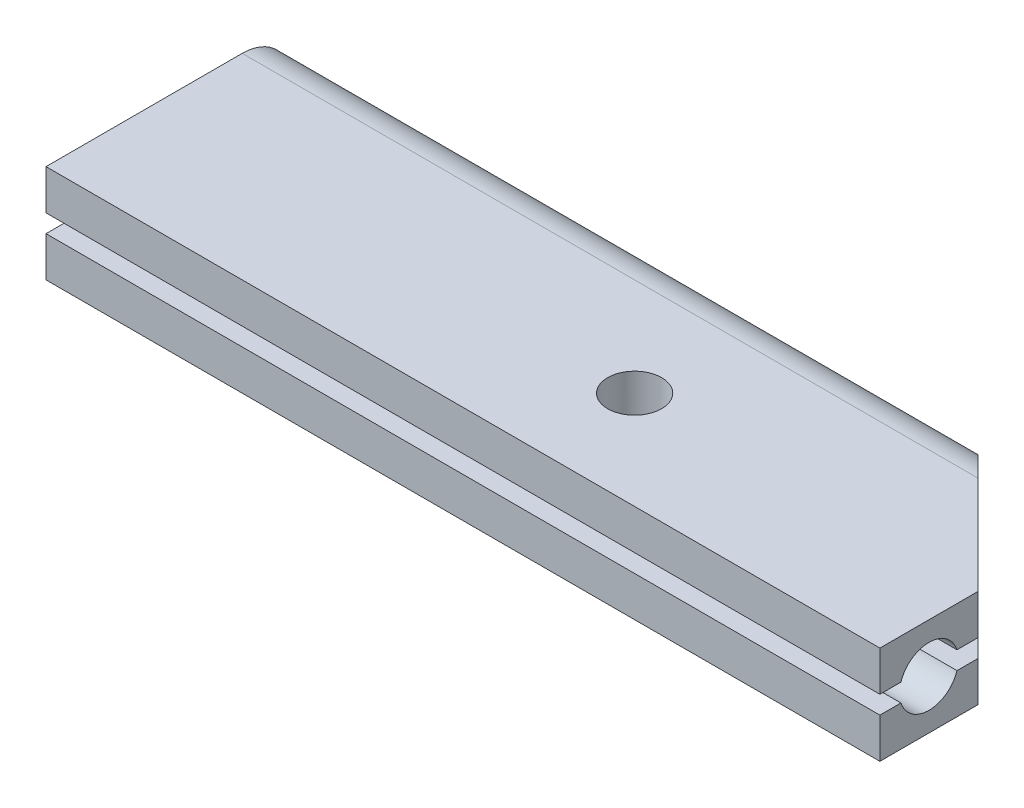
ISO-10303-21;
HEADER;
FILE_DESCRIPTION(('STEP AP214'),'2;1');
FILE_NAME('part.step','',(''),(''),'','','');
FILE_SCHEMA(('AUTOMOTIVE_DESIGN { 1 0 10303 214 1 1 1 1 }'));
ENDSEC;
DATA;
#1=APPLICATION_CONTEXT('core data for automotive mechanical design processes');
#2=APPLICATION_PROTOCOL_DEFINITION('international standard','automotive_design',2000,#1);
#3=PRODUCT_CONTEXT('',#1,'mechanical');
#4=PRODUCT('Part','Part','',(#3));
#5=PRODUCT_RELATED_PRODUCT_CATEGORY('part','',(#4));
#6=PRODUCT_DEFINITION_FORMATION('','',#4);
#7=PRODUCT_DEFINITION_CONTEXT('part definition',#1,'design');
#8=PRODUCT_DEFINITION('design','',#6,#7);
#9=PRODUCT_DEFINITION_SHAPE('','',#8);
#10=(LENGTH_UNIT() NAMED_UNIT(*) SI_UNIT(.MILLI.,.METRE.));
#11=(NAMED_UNIT(*) PLANE_ANGLE_UNIT() SI_UNIT($,.RADIAN.));
#12=(NAMED_UNIT(*) SI_UNIT($,.STERADIAN.) SOLID_ANGLE_UNIT());
#13=UNCERTAINTY_MEASURE_WITH_UNIT(LENGTH_MEASURE(1.E-05),#10,'distance_accuracy_value','');
#14=(GEOMETRIC_REPRESENTATION_CONTEXT(3) GLOBAL_UNCERTAINTY_ASSIGNED_CONTEXT((#13)) GLOBAL_UNIT_ASSIGNED_CONTEXT((#10,
#11,#12)) REPRESENTATION_CONTEXT('',''));
#15=CARTESIAN_POINT('',(0.,0.,0.));
#16=DIRECTION('',(0.,0.,1.));
#17=DIRECTION('',(1.,0.,0.));
#18=AXIS2_PLACEMENT_3D('',#15,#16,#17);
#19=CARTESIAN_POINT('',(0.,2.,0.));
#20=DIRECTION('',(0.,0.,-1.));
#21=DIRECTION('',(-1.,0.,0.));
#22=AXIS2_PLACEMENT_3D('',#19,#20,#21);
#23=PLANE('',#22);
#24=DIRECTION('',(0.,-1.,0.));
#25=VECTOR('',#24,1.);
#26=CARTESIAN_POINT('',(0.,2.,0.));
#27=LINE('',#26,#25);
#28=CARTESIAN_POINT('',(0.,2.,0.));
#29=VERTEX_POINT('',#28);
#30=CARTESIAN_POINT('',(0.,1.18360983346122,0.));
#31=VERTEX_POINT('',#30);
#32=EDGE_CURVE('E253',#29,#31,#27,.T.);
#33=ORIENTED_EDGE('',*,*,#32,.T.);
#34=DIRECTION('',(1.,0.,0.));
#35=VECTOR('',#34,1.);
#36=CARTESIAN_POINT('',(0.,1.18360983346122,0.));
#37=LINE('',#36,#35);
#38=CARTESIAN_POINT('',(17.,1.18360983346122,0.));
#39=VERTEX_POINT('',#38);
#40=EDGE_CURVE('E291',#31,#39,#37,.T.);
#41=ORIENTED_EDGE('',*,*,#40,.T.);
#42=DIRECTION('',(0.,-1.,0.));
#43=VECTOR('',#42,1.);
#44=CARTESIAN_POINT('',(17.,2.,0.));
#45=LINE('',#44,#43);
#46=CARTESIAN_POINT('',(17.,2.,0.));
#47=VERTEX_POINT('',#46);
#48=EDGE_CURVE('E262',#47,#39,#45,.T.);
#49=ORIENTED_EDGE('',*,*,#48,.F.);
#50=DIRECTION('',(1.,0.,0.));
#51=VECTOR('',#50,1.);
#52=CARTESIAN_POINT('',(0.,2.,0.));
#53=LINE('',#52,#51);
#54=EDGE_CURVE('E226',#29,#47,#53,.T.);
#55=ORIENTED_EDGE('',*,*,#54,.F.);
#56=EDGE_LOOP('',(#33,#41,#49,#55));
#57=FACE_BOUND('',#56,.T.);
#58=ADVANCED_FACE('F40',(#57),#23,.F.);
#59=CARTESIAN_POINT('',(17.,2.,0.));
#60=DIRECTION('',(-1.,0.,0.));
#61=DIRECTION('',(0.,0.,1.));
#62=AXIS2_PLACEMENT_3D('',#59,#60,#61);
#63=PLANE('',#62);
#64=ORIENTED_EDGE('',*,*,#48,.T.);
#65=DIRECTION('',(0.,0.,-1.));
#66=VECTOR('',#65,1.);
#67=CARTESIAN_POINT('',(17.,1.18360983346122,4.));
#68=LINE('',#67,#66);
#69=CARTESIAN_POINT('',(17.,1.18360983346122,-0.428784253494056));
#70=VERTEX_POINT('',#69);
#71=EDGE_CURVE('E315',#39,#70,#68,.T.);
#72=ORIENTED_EDGE('',*,*,#71,.T.);
#73=CARTESIAN_POINT('',(17.,1.,-1.));
#74=DIRECTION('',(1.,0.,0.));
#75=DIRECTION('',(0.,0.,-1.));
#76=AXIS2_PLACEMENT_3D('',#73,#74,#75);
#77=CIRCLE('',#76,0.6);
#78=CARTESIAN_POINT('',(17.,1.18360983346122,-1.57121574650594));
#79=VERTEX_POINT('',#78);
#80=EDGE_CURVE('E198',#79,#70,#77,.T.);
#81=ORIENTED_EDGE('',*,*,#80,.F.);
#82=CARTESIAN_POINT('',(17.,1.18360983346122,-2.));
#83=VERTEX_POINT('',#82);
#84=EDGE_CURVE('E327',#79,#83,#68,.T.);
#85=ORIENTED_EDGE('',*,*,#84,.T.);
#86=DIRECTION('',(0.,-1.,0.));
#87=VECTOR('',#86,1.);
#88=CARTESIAN_POINT('',(17.,2.,-2.));
#89=LINE('',#88,#87);
#90=CARTESIAN_POINT('',(17.,2.,-2.));
#91=VERTEX_POINT('',#90);
#92=EDGE_CURVE('E257',#91,#83,#89,.T.);
#93=ORIENTED_EDGE('',*,*,#92,.F.);
#94=DIRECTION('',(0.,0.,-1.));
#95=VECTOR('',#94,1.);
#96=CARTESIAN_POINT('',(17.,2.,0.));
#97=LINE('',#96,#95);
#98=EDGE_CURVE('E230',#47,#91,#97,.T.);
#99=ORIENTED_EDGE('',*,*,#98,.F.);
#100=EDGE_LOOP('',(#64,#72,#81,#85,#93,#99));
#101=FACE_BOUND('',#100,.T.);
#102=ADVANCED_FACE('F378',(#101),#63,.F.);
#103=CARTESIAN_POINT('',(0.,1.,-1.));
#104=DIRECTION('',(1.,0.,0.));
#105=DIRECTION('',(0.,0.,-1.));
#106=AXIS2_PLACEMENT_3D('',#103,#104,#105);
#107=CYLINDRICAL_SURFACE('',#106,0.6);
#108=DIRECTION('',(1.,0.,0.));
#109=VECTOR('',#108,1.);
#110=CARTESIAN_POINT('',(0.,1.18360983346122,-1.57121574650594));
#111=LINE('',#110,#109);
#112=CARTESIAN_POINT('',(0.,1.18360983346122,-1.57121574650594));
#113=VERTEX_POINT('',#112);
#114=CARTESIAN_POINT('',(9.65555252366211,1.18360983346122,-1.57121574650594));
#115=VERTEX_POINT('',#114);
#116=EDGE_CURVE('E186',#113,#115,#111,.T.);
#117=ORIENTED_EDGE('',*,*,#116,.T.);
#118=CARTESIAN_POINT('',(9.65555252366211,1.18360983346122,-1.57121574650594));
#119=CARTESIAN_POINT('',(9.66279970457695,1.2017996989591,-1.56540068980402));
#120=CARTESIAN_POINT('',(9.67137012518386,1.21922681571415,-1.55881056116524));
#121=CARTESIAN_POINT('',(9.69114316293411,1.25211460788407,-1.54474608212787));
#122=CARTESIAN_POINT('',(9.70234543544478,1.26757554035632,-1.53727184756372));
#123=CARTESIAN_POINT('',(9.72740336090944,1.29613326157097,-1.5220828642431));
#124=CARTESIAN_POINT('',(9.74126605075027,1.30922359742965,-1.51436752410566));
#125=CARTESIAN_POINT('',(9.77134840294039,1.33270370346373,-1.49950097839327));
#126=CARTESIAN_POINT('',(9.78756549894581,1.34309638018076,-1.49234917148703));
#127=CARTESIAN_POINT('',(9.8213114480067,1.36078019945433,-1.47953449579756));
#128=CARTESIAN_POINT('',(9.83877251604817,1.36816909503888,-1.47382747341874));
#129=CARTESIAN_POINT('',(9.87500860454101,1.38040509689461,-1.46406200810876));
#130=CARTESIAN_POINT('',(9.89378448637781,1.38525051884221,-1.46000465801333));
#131=CARTESIAN_POINT('',(9.9323261560955,1.39251065343406,-1.45382659913236));
#132=CARTESIAN_POINT('',(9.95210054913085,1.39489809442002,-1.45172764247009));
#133=CARTESIAN_POINT('',(9.99190095940925,1.3972070888115,-1.44969865997932));
#134=CARTESIAN_POINT('',(10.0119269709472,1.39712869802611,-1.44976858506259));
#135=CARTESIAN_POINT('',(10.0521374086804,1.3944746134966,-1.45209847924781));
#136=CARTESIAN_POINT('',(10.0723153900627,1.39184320536989,-1.45440730725256));
#137=CARTESIAN_POINT('',(10.111788693259,1.38393419343475,-1.46110862807258));
#138=CARTESIAN_POINT('',(10.1310840762296,1.37865677327609,-1.46550097627738));
#139=CARTESIAN_POINT('',(10.1680651410834,1.36542360170452,-1.47595768293658));
#140=CARTESIAN_POINT('',(10.1857625801894,1.35748985824932,-1.48200823059855));
#141=CARTESIAN_POINT('',(10.219196436814,1.33891052240597,-1.49524634912894));
#142=CARTESIAN_POINT('',(10.2349334605517,1.32826577145779,-1.50243356693687));
#143=CARTESIAN_POINT('',(10.2636900709056,1.30467507731902,-1.51706926329337));
#144=CARTESIAN_POINT('',(10.276766729627,1.29179181737611,-1.52450704539664));
#145=CARTESIAN_POINT('',(10.3004716631775,1.26381527756615,-1.53911918438621));
#146=CARTESIAN_POINT('',(10.3111006983645,1.24872268642057,-1.54629362249693));
#147=CARTESIAN_POINT('',(10.3250655911445,1.2249348205964,-1.55630614870017));
#148=CARTESIAN_POINT('',(10.3293495519523,1.21691970932856,-1.55948399217574));
#149=CARTESIAN_POINT('',(10.3373305592435,1.2005280864668,-1.56556593460097));
#150=CARTESIAN_POINT('',(10.3410289440165,1.19215245625575,-1.56847065139938));
#151=CARTESIAN_POINT('',(10.3444474763379,1.18360983346122,-1.57121574650594));
#152=B_SPLINE_CURVE_WITH_KNOTS('',3,(#118,#119,#120,#121,#122,#123,#124,#125,#126,#127,#128,
#129,#130,#131,#132,#133,#134,#135,#136,#137,#138,#139,#140,#141,#142,#143,#144,#145,#146,#147,
#148,#149,#150,#151),.UNSPECIFIED.,.F.,.F.,(4,2,2,2,2,2,2,2,2,2,2,2,2,2,2,2,4),(0.,
0.0612291886485581,0.122450363993332,0.183835760494648,0.24515474133408,0.30427752001567,
0.363439401387274,0.423250840670739,0.483060926244769,0.544206299906491,0.605347430284473,
0.665994042612836,0.726621854394047,0.785766120808207,0.844891989110295,0.873750915169892,
0.902542903466302),.UNSPECIFIED.);
#153=CARTESIAN_POINT('',(10.3444474763379,1.18360983346122,-1.57121574650594));
#154=VERTEX_POINT('',#153);
#155=EDGE_CURVE('E55',#115,#154,#152,.T.);
#156=ORIENTED_EDGE('',*,*,#155,.T.);
#157=EDGE_CURVE('E180',#154,#79,#111,.T.);
#158=ORIENTED_EDGE('',*,*,#157,.T.);
#159=ORIENTED_EDGE('',*,*,#80,.T.);
#160=DIRECTION('',(1.,0.,0.));
#161=VECTOR('',#160,1.);
#162=CARTESIAN_POINT('',(0.,1.18360983346122,-0.428784253494056));
#163=LINE('',#162,#161);
#164=CARTESIAN_POINT('',(0.,1.18360983346122,-0.428784253494056));
#165=VERTEX_POINT('',#164);
#166=EDGE_CURVE('E49',#70,#165,#163,.F.);
#167=ORIENTED_EDGE('',*,*,#166,.T.);
#168=CARTESIAN_POINT('',(0.,1.,-1.));
#169=DIRECTION('',(1.,0.,0.));
#170=DIRECTION('',(0.,0.,-1.));
#171=AXIS2_PLACEMENT_3D('',#168,#169,#170);
#172=CIRCLE('',#171,0.6);
#173=EDGE_CURVE('E196',#113,#165,#172,.T.);
#174=ORIENTED_EDGE('',*,*,#173,.F.);
#175=EDGE_LOOP('',(#117,#156,#158,#159,#167,#174));
#176=FACE_BOUND('',#175,.T.);
#177=ADVANCED_FACE('F195',(#176),#107,.F.);
#178=CARTESIAN_POINT('',(17.,0.816390166538781,0.));
#179=VERTEX_POINT('',#178);
#180=CARTESIAN_POINT('',(17.,0.,0.));
#181=VERTEX_POINT('',#180);
#182=EDGE_CURVE('E261',#179,#181,#45,.T.);
#183=ORIENTED_EDGE('',*,*,#182,.F.);
#184=DIRECTION('',(-1.,0.,0.));
#185=VECTOR('',#184,1.);
#186=CARTESIAN_POINT('',(0.,0.816390166538781,0.));
#187=LINE('',#186,#185);
#188=CARTESIAN_POINT('',(0.,0.816390166538781,0.));
#189=VERTEX_POINT('',#188);
#190=EDGE_CURVE('E302',#179,#189,#187,.T.);
#191=ORIENTED_EDGE('',*,*,#190,.T.);
#192=CARTESIAN_POINT('',(0.,0.,0.));
#193=VERTEX_POINT('',#192);
#194=EDGE_CURVE('E241',#189,#193,#27,.T.);
#195=ORIENTED_EDGE('',*,*,#194,.T.);
#196=DIRECTION('',(1.,0.,0.));
#197=VECTOR('',#196,1.);
#198=CARTESIAN_POINT('',(0.,0.,0.));
#199=LINE('',#198,#197);
#200=EDGE_CURVE('E211',#193,#181,#199,.T.);
#201=ORIENTED_EDGE('',*,*,#200,.T.);
#202=EDGE_LOOP('',(#183,#191,#195,#201));
#203=FACE_BOUND('',#202,.T.);
#204=ADVANCED_FACE('F380',(#203),#23,.F.);
#205=CARTESIAN_POINT('',(17.,0.816390166538781,-2.));
#206=VERTEX_POINT('',#205);
#207=CARTESIAN_POINT('',(17.,0.,-2.));
#208=VERTEX_POINT('',#207);
#209=EDGE_CURVE('E256',#206,#208,#89,.T.);
#210=ORIENTED_EDGE('',*,*,#209,.F.);
#211=DIRECTION('',(0.,0.,1.));
#212=VECTOR('',#211,1.);
#213=CARTESIAN_POINT('',(17.,0.816390166538782,4.));
#214=LINE('',#213,#212);
#215=CARTESIAN_POINT('',(17.,0.816390166538781,-1.57121574650594));
#216=VERTEX_POINT('',#215);
#217=EDGE_CURVE('E331',#206,#216,#214,.T.);
#218=ORIENTED_EDGE('',*,*,#217,.T.);
#219=CARTESIAN_POINT('',(17.,0.816390166538781,-0.428784253494056));
#220=VERTEX_POINT('',#219);
#221=EDGE_CURVE('E225',#220,#216,#77,.T.);
#222=ORIENTED_EDGE('',*,*,#221,.F.);
#223=EDGE_CURVE('E332',#220,#179,#214,.T.);
#224=ORIENTED_EDGE('',*,*,#223,.T.);
#225=ORIENTED_EDGE('',*,*,#182,.T.);
#226=DIRECTION('',(0.,0.,-1.));
#227=VECTOR('',#226,1.);
#228=CARTESIAN_POINT('',(17.,0.,0.));
#229=LINE('',#228,#227);
#230=EDGE_CURVE('E217',#181,#208,#229,.T.);
#231=ORIENTED_EDGE('',*,*,#230,.T.);
#232=EDGE_LOOP('',(#210,#218,#222,#224,#225,#231));
#233=FACE_BOUND('',#232,.T.);
#234=ADVANCED_FACE('F386',(#233),#63,.F.);
#235=CARTESIAN_POINT('',(9.5000000000001,2.,-9.49999999999999));
#236=DIRECTION('',(0.707106781186552,0.,-0.707106781186544));
#237=DIRECTION('',(-0.707106781186544,0.,-0.707106781186551));
#238=AXIS2_PLACEMENT_3D('',#235,#236,#237);
#239=PLANE('',#238);
#240=DIRECTION('',(0.707106781186544,0.,0.707106781186551));
#241=VECTOR('',#240,1.);
#242=CARTESIAN_POINT('',(9.5000000000001,1.18360983346122,-9.49999999999999));
#243=LINE('',#242,#241);
#244=CARTESIAN_POINT('',(15.,1.18360983346122,-4.));
#245=VERTEX_POINT('',#244);
#246=EDGE_CURVE('E298',#245,#83,#243,.T.);
#247=ORIENTED_EDGE('',*,*,#246,.F.);
#248=DIRECTION('',(0.,1.,0.));
#249=VECTOR('',#248,1.);
#250=CARTESIAN_POINT('',(15.,2.,-4.));
#251=LINE('',#250,#249);
#252=CARTESIAN_POINT('',(15.,0.816390166538781,-4.));
#253=VERTEX_POINT('',#252);
#254=EDGE_CURVE('E221',#253,#245,#251,.T.);
#255=ORIENTED_EDGE('',*,*,#254,.F.);
#256=DIRECTION('',(-0.707106781186544,0.,-0.707106781186551));
#257=VECTOR('',#256,1.);
#258=CARTESIAN_POINT('',(9.5000000000001,0.81639016653878,-9.49999999999999));
#259=LINE('',#258,#257);
#260=EDGE_CURVE('E308',#206,#253,#259,.T.);
#261=ORIENTED_EDGE('',*,*,#260,.F.);
#262=ORIENTED_EDGE('',*,*,#209,.T.);
#263=DIRECTION('',(0.707106781186544,0.,0.707106781186551));
#264=VECTOR('',#263,1.);
#265=CARTESIAN_POINT('',(9.5000000000001,0.,-9.49999999999999));
#266=LINE('',#265,#264);
#267=CARTESIAN_POINT('',(15.,0.,-4.));
#268=VERTEX_POINT('',#267);
#269=EDGE_CURVE('E246',#268,#208,#266,.T.);
#270=ORIENTED_EDGE('',*,*,#269,.F.);
#271=CARTESIAN_POINT('',(15.,1.,-4.));
#272=DIRECTION('',(0.707106781186552,0.,-0.707106781186544));
#273=DIRECTION('',(-0.707106781186544,0.,-0.707106781186551));
#274=AXIS2_PLACEMENT_3D('',#271,#272,#273);
#275=ELLIPSE('',#274,1.41421356237309,1.);
#276=CARTESIAN_POINT('',(14.,1.,-5.));
#277=VERTEX_POINT('',#276);
#278=EDGE_CURVE('E273',#268,#277,#275,.T.);
#279=ORIENTED_EDGE('',*,*,#278,.T.);
#280=CARTESIAN_POINT('',(15.,1.,-4.));
#281=DIRECTION('',(0.707106781186552,0.,-0.707106781186544));
#282=DIRECTION('',(0.707106781186544,0.,0.707106781186551));
#283=AXIS2_PLACEMENT_3D('',#280,#281,#282);
#284=ELLIPSE('',#283,1.41421356237309,1.);
#285=CARTESIAN_POINT('',(15.,2.,-4.));
#286=VERTEX_POINT('',#285);
#287=EDGE_CURVE('E270',#277,#286,#284,.T.);
#288=ORIENTED_EDGE('',*,*,#287,.T.);
#289=DIRECTION('',(0.707106781186544,0.,0.707106781186551));
#290=VECTOR('',#289,1.);
#291=CARTESIAN_POINT('',(9.5000000000001,2.,-9.49999999999999));
#292=LINE('',#291,#290);
#293=EDGE_CURVE('E235',#286,#91,#292,.T.);
#294=ORIENTED_EDGE('',*,*,#293,.T.);
#295=ORIENTED_EDGE('',*,*,#92,.T.);
#296=EDGE_LOOP('',(#247,#255,#261,#262,#270,#279,#288,#294,#295));
#297=FACE_BOUND('',#296,.T.);
#298=ADVANCED_FACE('F393',(#297),#239,.T.);
#299=CARTESIAN_POINT('',(0.,2.,0.));
#300=DIRECTION('',(-1.,0.,0.));
#301=DIRECTION('',(0.,0.,1.));
#302=AXIS2_PLACEMENT_3D('',#299,#300,#301);
#303=PLANE('',#302);
#304=DIRECTION('',(0.,0.,-1.));
#305=VECTOR('',#304,1.);
#306=CARTESIAN_POINT('',(0.,1.18360983346122,4.));
#307=LINE('',#306,#305);
#308=EDGE_CURVE('E205',#31,#165,#307,.T.);
#309=ORIENTED_EDGE('',*,*,#308,.F.);
#310=ORIENTED_EDGE('',*,*,#32,.F.);
#311=DIRECTION('',(0.,0.,-1.));
#312=VECTOR('',#311,1.);
#313=CARTESIAN_POINT('',(0.,2.,0.));
#314=LINE('',#313,#312);
#315=CARTESIAN_POINT('',(0.,2.,-4.));
#316=VERTEX_POINT('',#315);
#317=EDGE_CURVE('E238',#29,#316,#314,.T.);
#318=ORIENTED_EDGE('',*,*,#317,.T.);
#319=CARTESIAN_POINT('',(0.,1.,-4.));
#320=DIRECTION('',(-1.,0.,0.));
#321=DIRECTION('',(0.,0.,1.));
#322=AXIS2_PLACEMENT_3D('',#319,#320,#321);
#323=CIRCLE('',#322,1.);
#324=CARTESIAN_POINT('',(0.,1.,-5.));
#325=VERTEX_POINT('',#324);
#326=EDGE_CURVE('E276',#316,#325,#323,.T.);
#327=ORIENTED_EDGE('',*,*,#326,.T.);
#328=CARTESIAN_POINT('',(0.,1.,-4.));
#329=DIRECTION('',(-1.,0.,0.));
#330=DIRECTION('',(0.,0.,1.));
#331=AXIS2_PLACEMENT_3D('',#328,#329,#330);
#332=CIRCLE('',#331,1.);
#333=CARTESIAN_POINT('',(0.,0.,-4.));
#334=VERTEX_POINT('',#333);
#335=EDGE_CURVE('E279',#325,#334,#332,.T.);
#336=ORIENTED_EDGE('',*,*,#335,.T.);
#337=DIRECTION('',(0.,0.,-1.));
#338=VECTOR('',#337,1.);
#339=CARTESIAN_POINT('',(0.,0.,0.));
#340=LINE('',#339,#338);
#341=EDGE_CURVE('E231',#193,#334,#340,.T.);
#342=ORIENTED_EDGE('',*,*,#341,.F.);
#343=ORIENTED_EDGE('',*,*,#194,.F.);
#344=DIRECTION('',(0.,0.,1.));
#345=VECTOR('',#344,1.);
#346=CARTESIAN_POINT('',(0.,0.816390166538782,4.));
#347=LINE('',#346,#345);
#348=CARTESIAN_POINT('',(0.,0.816390166538781,-0.428784253494056));
#349=VERTEX_POINT('',#348);
#350=EDGE_CURVE('E322',#349,#189,#347,.T.);
#351=ORIENTED_EDGE('',*,*,#350,.F.);
#352=CARTESIAN_POINT('',(0.,0.816390166538781,-1.57121574650594));
#353=VERTEX_POINT('',#352);
#354=EDGE_CURVE('E212',#349,#353,#172,.T.);
#355=ORIENTED_EDGE('',*,*,#354,.T.);
#356=CARTESIAN_POINT('',(0.,0.816390166538781,-4.));
#357=VERTEX_POINT('',#356);
#358=EDGE_CURVE('E173',#357,#353,#347,.T.);
#359=ORIENTED_EDGE('',*,*,#358,.F.);
#360=DIRECTION('',(0.,-1.,0.));
#361=VECTOR('',#360,1.);
#362=CARTESIAN_POINT('',(0.,0.816390166538781,-4.));
#363=LINE('',#362,#361);
#364=CARTESIAN_POINT('',(0.,1.18360983346122,-4.));
#365=VERTEX_POINT('',#364);
#366=EDGE_CURVE('E323',#365,#357,#363,.T.);
#367=ORIENTED_EDGE('',*,*,#366,.F.);
#368=EDGE_CURVE('E209',#113,#365,#307,.T.);
#369=ORIENTED_EDGE('',*,*,#368,.F.);
#370=ORIENTED_EDGE('',*,*,#173,.T.);
#371=EDGE_LOOP('',(#309,#310,#318,#327,#336,#342,#343,#351,#355,#359,#367,#369,#370));
#372=FACE_BOUND('',#371,.T.);
#373=ADVANCED_FACE('F204',(#372),#303,.T.);
#374=CARTESIAN_POINT('',(0.,2.,0.));
#375=DIRECTION('',(0.,1.,0.));
#376=DIRECTION('',(0.,0.,1.));
#377=AXIS2_PLACEMENT_3D('',#374,#375,#376);
#378=PLANE('',#377);
#379=CARTESIAN_POINT('',(10.,2.,-2.));
#380=DIRECTION('',(0.,1.,0.));
#381=DIRECTION('',(0.,0.,1.));
#382=AXIS2_PLACEMENT_3D('',#379,#380,#381);
#383=CIRCLE('',#382,0.55);
#384=CARTESIAN_POINT('',(10.,2.,-1.45));
#385=VERTEX_POINT('',#384);
#386=EDGE_CURVE('E360',#385,#385,#383,.T.);
#387=ORIENTED_EDGE('',*,*,#386,.F.);
#388=EDGE_LOOP('',(#387));
#389=FACE_BOUND('',#388,.T.);
#390=ORIENTED_EDGE('',*,*,#293,.F.);
#391=DIRECTION('',(1.,0.,0.));
#392=VECTOR('',#391,1.);
#393=CARTESIAN_POINT('',(0.,2.,-4.));
#394=LINE('',#393,#392);
#395=EDGE_CURVE('E182',#286,#316,#394,.F.);
#396=ORIENTED_EDGE('',*,*,#395,.T.);
#397=ORIENTED_EDGE('',*,*,#317,.F.);
#398=ORIENTED_EDGE('',*,*,#54,.T.);
#399=ORIENTED_EDGE('',*,*,#98,.T.);
#400=EDGE_LOOP('',(#390,#396,#397,#398,#399));
#401=FACE_BOUND('',#400,.T.);
#402=ADVANCED_FACE('F432',(#389,#401),#378,.T.);
#403=CARTESIAN_POINT('',(0.,0.,0.));
#404=DIRECTION('',(0.,1.,0.));
#405=DIRECTION('',(0.,0.,1.));
#406=AXIS2_PLACEMENT_3D('',#403,#404,#405);
#407=PLANE('',#406);
#408=CARTESIAN_POINT('',(10.,0.,-2.));
#409=DIRECTION('',(0.,1.,0.));
#410=DIRECTION('',(0.,0.,1.));
#411=AXIS2_PLACEMENT_3D('',#408,#409,#410);
#412=CIRCLE('',#411,0.55);
#413=CARTESIAN_POINT('',(10.,0.,-1.45));
#414=VERTEX_POINT('',#413);
#415=EDGE_CURVE('E169',#414,#414,#412,.T.);
#416=ORIENTED_EDGE('',*,*,#415,.T.);
#417=EDGE_LOOP('',(#416));
#418=FACE_BOUND('',#417,.T.);
#419=ORIENTED_EDGE('',*,*,#341,.T.);
#420=DIRECTION('',(1.,0.,0.));
#421=VECTOR('',#420,1.);
#422=CARTESIAN_POINT('',(14.,0.,-4.));
#423=LINE('',#422,#421);
#424=EDGE_CURVE('E266',#334,#268,#423,.T.);
#425=ORIENTED_EDGE('',*,*,#424,.T.);
#426=ORIENTED_EDGE('',*,*,#269,.T.);
#427=ORIENTED_EDGE('',*,*,#230,.F.);
#428=ORIENTED_EDGE('',*,*,#200,.F.);
#429=EDGE_LOOP('',(#419,#425,#426,#427,#428));
#430=FACE_BOUND('',#429,.T.);
#431=ADVANCED_FACE('F368',(#418,#430),#407,.F.);
#432=DIRECTION('',(1.,0.,0.));
#433=VECTOR('',#432,1.);
#434=CARTESIAN_POINT('',(0.,0.816390166538781,-1.57121574650594));
#435=LINE('',#434,#433);
#436=CARTESIAN_POINT('',(10.3444474763379,0.816390166538781,-1.57121574650594));
#437=VERTEX_POINT('',#436);
#438=EDGE_CURVE('E166',#216,#437,#435,.F.);
#439=ORIENTED_EDGE('',*,*,#438,.T.);
#440=CARTESIAN_POINT('',(10.3444474763379,0.816390166538781,-1.57121574650594));
#441=CARTESIAN_POINT('',(10.3372002954231,0.798200301040905,-1.56540068980402));
#442=CARTESIAN_POINT('',(10.3286298748161,0.780773184285848,-1.55881056116524));
#443=CARTESIAN_POINT('',(10.3088568370659,0.747885392115931,-1.54474608212787));
#444=CARTESIAN_POINT('',(10.2976545645552,0.73242445964368,-1.53727184756372));
#445=CARTESIAN_POINT('',(10.2725966390906,0.703866738429034,-1.5220828642431));
#446=CARTESIAN_POINT('',(10.2587339492497,0.690776402570348,-1.51436752410566));
#447=CARTESIAN_POINT('',(10.2286515970596,0.667296296536267,-1.49950097839327));
#448=CARTESIAN_POINT('',(10.2124345010542,0.656903619819244,-1.49234917148703));
#449=CARTESIAN_POINT('',(10.1786885519933,0.639219800545667,-1.47953449579756));
#450=CARTESIAN_POINT('',(10.1612274839518,0.631830904961119,-1.47382747341874));
#451=CARTESIAN_POINT('',(10.124991395459,0.619594903105394,-1.46406200810876));
#452=CARTESIAN_POINT('',(10.1062155136222,0.614749481157786,-1.46000465801333));
#453=CARTESIAN_POINT('',(10.0676738439045,0.607489346565942,-1.45382659913236));
#454=CARTESIAN_POINT('',(10.0478994508692,0.605101905579984,-1.45172764247009));
#455=CARTESIAN_POINT('',(10.0080990405908,0.602792911188504,-1.44969865997932));
#456=CARTESIAN_POINT('',(9.98807302905284,0.602871301973891,-1.44976858506259));
#457=CARTESIAN_POINT('',(9.94786259131957,0.605525386503402,-1.45209847924781));
#458=CARTESIAN_POINT('',(9.92768460993733,0.60815679463011,-1.45440730725256));
#459=CARTESIAN_POINT('',(9.88821130674095,0.616065806565248,-1.46110862807258));
#460=CARTESIAN_POINT('',(9.86891592377038,0.621343226723906,-1.46550097627738));
#461=CARTESIAN_POINT('',(9.83193485891663,0.634576398295477,-1.47595768293658));
#462=CARTESIAN_POINT('',(9.81423741981065,0.642510141750683,-1.48200823059855));
#463=CARTESIAN_POINT('',(9.78080356318605,0.661089477594031,-1.49524634912894));
#464=CARTESIAN_POINT('',(9.76506653944832,0.67173422854221,-1.50243356693687));
#465=CARTESIAN_POINT('',(9.73630992909437,0.695324922680978,-1.51706926329337));
#466=CARTESIAN_POINT('',(9.72323327037305,0.708208182623885,-1.52450704539664));
#467=CARTESIAN_POINT('',(9.69952833682248,0.736184722433851,-1.53911918438621));
#468=CARTESIAN_POINT('',(9.68889930163547,0.751277313579426,-1.54629362249693));
#469=CARTESIAN_POINT('',(9.6749344088555,0.775065179403596,-1.55630614870017));
#470=CARTESIAN_POINT('',(9.67065044804773,0.783080290671439,-1.55948399217574));
#471=CARTESIAN_POINT('',(9.66266944075655,0.799471913533201,-1.56556593460097));
#472=CARTESIAN_POINT('',(9.65897105598354,0.807847543744246,-1.56847065139938));
#473=CARTESIAN_POINT('',(9.65555252366211,0.816390166538781,-1.57121574650594));
#474=B_SPLINE_CURVE_WITH_KNOTS('',3,(#440,#441,#442,#443,#444,#445,#446,#447,#448,#449,#450,
#451,#452,#453,#454,#455,#456,#457,#458,#459,#460,#461,#462,#463,#464,#465,#466,#467,#468,#469,
#470,#471,#472,#473),.UNSPECIFIED.,.F.,.F.,(4,2,2,2,2,2,2,2,2,2,2,2,2,2,2,2,4),(0.,
0.0612291886485574,0.122450363993331,0.183835760494647,0.24515474133408,0.304277520015669,
0.363439401387274,0.423250840670738,0.483060926244769,0.544206299906491,0.605347430284473,
0.665994042612835,0.726621854394047,0.785766120808206,0.844891989110295,0.873750915169893,
0.902542903466302),.UNSPECIFIED.);
#475=CARTESIAN_POINT('',(9.65555252366211,0.816390166538781,-1.57121574650594));
#476=VERTEX_POINT('',#475);
#477=EDGE_CURVE('E62',#437,#476,#474,.T.);
#478=ORIENTED_EDGE('',*,*,#477,.T.);
#479=EDGE_CURVE('E163',#476,#353,#435,.F.);
#480=ORIENTED_EDGE('',*,*,#479,.T.);
#481=ORIENTED_EDGE('',*,*,#354,.F.);
#482=DIRECTION('',(1.,0.,0.));
#483=VECTOR('',#482,1.);
#484=CARTESIAN_POINT('',(0.,0.816390166538781,-0.428784253494056));
#485=LINE('',#484,#483);
#486=EDGE_CURVE('E176',#349,#220,#485,.T.);
#487=ORIENTED_EDGE('',*,*,#486,.T.);
#488=ORIENTED_EDGE('',*,*,#221,.T.);
#489=EDGE_LOOP('',(#439,#478,#480,#481,#487,#488));
#490=FACE_BOUND('',#489,.T.);
#491=ADVANCED_FACE('F161',(#490),#107,.F.);
#492=CARTESIAN_POINT('',(0.,1.,-4.));
#493=DIRECTION('',(1.,0.,0.));
#494=DIRECTION('',(0.,0.,-1.));
#495=AXIS2_PLACEMENT_3D('',#492,#493,#494);
#496=CYLINDRICAL_SURFACE('',#495,1.);
#497=DIRECTION('',(1.,0.,0.));
#498=VECTOR('',#497,1.);
#499=CARTESIAN_POINT('',(0.,1.,-5.));
#500=LINE('',#499,#498);
#501=EDGE_CURVE('E283',#325,#277,#500,.T.);
#502=ORIENTED_EDGE('',*,*,#501,.F.);
#503=ORIENTED_EDGE('',*,*,#326,.F.);
#504=ORIENTED_EDGE('',*,*,#395,.F.);
#505=ORIENTED_EDGE('',*,*,#287,.F.);
#506=EDGE_LOOP('',(#502,#503,#504,#505));
#507=FACE_BOUND('',#506,.T.);
#508=ADVANCED_FACE('F42',(#507),#496,.T.);
#509=CARTESIAN_POINT('',(0.,1.,-4.));
#510=DIRECTION('',(-1.,0.,0.));
#511=DIRECTION('',(0.,0.,1.));
#512=AXIS2_PLACEMENT_3D('',#509,#510,#511);
#513=CYLINDRICAL_SURFACE('',#512,1.);
#514=ORIENTED_EDGE('',*,*,#335,.F.);
#515=ORIENTED_EDGE('',*,*,#501,.T.);
#516=ORIENTED_EDGE('',*,*,#278,.F.);
#517=ORIENTED_EDGE('',*,*,#424,.F.);
#518=EDGE_LOOP('',(#514,#515,#516,#517));
#519=FACE_BOUND('',#518,.T.);
#520=ADVANCED_FACE('F407',(#519),#513,.T.);
#521=CARTESIAN_POINT('',(17.,0.816390166538782,4.));
#522=DIRECTION('',(0.,-1.,0.));
#523=DIRECTION('',(0.,0.,-1.));
#524=AXIS2_PLACEMENT_3D('',#521,#522,#523);
#525=PLANE('',#524);
#526=ORIENTED_EDGE('',*,*,#223,.F.);
#527=ORIENTED_EDGE('',*,*,#486,.F.);
#528=ORIENTED_EDGE('',*,*,#350,.T.);
#529=ORIENTED_EDGE('',*,*,#190,.F.);
#530=EDGE_LOOP('',(#526,#527,#528,#529));
#531=FACE_BOUND('',#530,.T.);
#532=ADVANCED_FACE('F418',(#531),#525,.F.);
#533=CARTESIAN_POINT('',(17.,1.18360983346122,4.));
#534=DIRECTION('',(0.,1.,0.));
#535=DIRECTION('',(0.,0.,1.));
#536=AXIS2_PLACEMENT_3D('',#533,#534,#535);
#537=PLANE('',#536);
#538=ORIENTED_EDGE('',*,*,#157,.F.);
#539=CARTESIAN_POINT('',(10.,1.18360983346122,-2.));
#540=DIRECTION('',(0.,1.,0.));
#541=DIRECTION('',(0.,0.,1.));
#542=AXIS2_PLACEMENT_3D('',#539,#540,#541);
#543=CIRCLE('',#542,0.55);
#544=EDGE_CURVE('E168',#154,#115,#543,.T.);
#545=ORIENTED_EDGE('',*,*,#544,.T.);
#546=ORIENTED_EDGE('',*,*,#116,.F.);
#547=ORIENTED_EDGE('',*,*,#368,.T.);
#548=DIRECTION('',(-1.,0.,0.));
#549=VECTOR('',#548,1.);
#550=CARTESIAN_POINT('',(17.,1.18360983346122,-4.));
#551=LINE('',#550,#549);
#552=EDGE_CURVE('E311',#245,#365,#551,.T.);
#553=ORIENTED_EDGE('',*,*,#552,.F.);
#554=ORIENTED_EDGE('',*,*,#246,.T.);
#555=ORIENTED_EDGE('',*,*,#84,.F.);
#556=EDGE_LOOP('',(#538,#545,#546,#547,#553,#554,#555));
#557=FACE_BOUND('',#556,.T.);
#558=ADVANCED_FACE('F376',(#557),#537,.F.);
#559=ORIENTED_EDGE('',*,*,#479,.F.);
#560=CARTESIAN_POINT('',(10.,0.816390166538781,-2.));
#561=DIRECTION('',(0.,-1.,0.));
#562=DIRECTION('',(0.,0.,-1.));
#563=AXIS2_PLACEMENT_3D('',#560,#561,#562);
#564=CIRCLE('',#563,0.55);
#565=EDGE_CURVE('E11',#476,#437,#564,.T.);
#566=ORIENTED_EDGE('',*,*,#565,.T.);
#567=ORIENTED_EDGE('',*,*,#438,.F.);
#568=ORIENTED_EDGE('',*,*,#217,.F.);
#569=ORIENTED_EDGE('',*,*,#260,.T.);
#570=DIRECTION('',(-1.,0.,0.));
#571=VECTOR('',#570,1.);
#572=CARTESIAN_POINT('',(17.,0.816390166538781,-4.));
#573=LINE('',#572,#571);
#574=EDGE_CURVE('E312',#253,#357,#573,.T.);
#575=ORIENTED_EDGE('',*,*,#574,.T.);
#576=ORIENTED_EDGE('',*,*,#358,.T.);
#577=EDGE_LOOP('',(#559,#566,#567,#568,#569,#575,#576));
#578=FACE_BOUND('',#577,.T.);
#579=ADVANCED_FACE('F171',(#578),#525,.F.);
#580=CARTESIAN_POINT('',(17.,0.816390166538781,-4.));
#581=DIRECTION('',(0.,0.,-1.));
#582=DIRECTION('',(-1.,0.,0.));
#583=AXIS2_PLACEMENT_3D('',#580,#581,#582);
#584=PLANE('',#583);
#585=ORIENTED_EDGE('',*,*,#254,.T.);
#586=ORIENTED_EDGE('',*,*,#552,.T.);
#587=ORIENTED_EDGE('',*,*,#366,.T.);
#588=ORIENTED_EDGE('',*,*,#574,.F.);
#589=EDGE_LOOP('',(#585,#586,#587,#588));
#590=FACE_BOUND('',#589,.T.);
#591=ADVANCED_FACE('F375',(#590),#584,.F.);
#592=ORIENTED_EDGE('',*,*,#308,.T.);
#593=ORIENTED_EDGE('',*,*,#166,.F.);
#594=ORIENTED_EDGE('',*,*,#71,.F.);
#595=ORIENTED_EDGE('',*,*,#40,.F.);
#596=EDGE_LOOP('',(#592,#593,#594,#595));
#597=FACE_BOUND('',#596,.T.);
#598=ADVANCED_FACE('F352',(#597),#537,.F.);
#599=CARTESIAN_POINT('',(10.,0.,-2.));
#600=DIRECTION('',(0.,1.,0.));
#601=DIRECTION('',(0.,0.,1.));
#602=AXIS2_PLACEMENT_3D('',#599,#600,#601);
#603=CYLINDRICAL_SURFACE('',#602,0.55);
#604=ORIENTED_EDGE('',*,*,#415,.F.);
#605=EDGE_LOOP('',(#604));
#606=FACE_BOUND('',#605,.T.);
#607=ORIENTED_EDGE('',*,*,#565,.F.);
#608=ORIENTED_EDGE('',*,*,#477,.F.);
#609=EDGE_LOOP('',(#607,#608));
#610=FACE_BOUND('',#609,.T.);
#611=ADVANCED_FACE('F156',(#606,#610),#603,.F.);
#612=ORIENTED_EDGE('',*,*,#386,.T.);
#613=EDGE_LOOP('',(#612));
#614=FACE_BOUND('',#613,.T.);
#615=ORIENTED_EDGE('',*,*,#544,.F.);
#616=ORIENTED_EDGE('',*,*,#155,.F.);
#617=EDGE_LOOP('',(#615,#616));
#618=FACE_BOUND('',#617,.T.);
#619=ADVANCED_FACE('F347',(#614,#618),#603,.F.);
#620=CLOSED_SHELL('',(#58,#102,#177,#204,#234,#298,#373,#402,#431,#491,#508,#520,#532,#558,#579,
#591,#598,#611,#619));
#621=MANIFOLD_SOLID_BREP('B2',#620);
#622=ADVANCED_BREP_SHAPE_REPRESENTATION('',(#18,#621),#14);
#623=SHAPE_DEFINITION_REPRESENTATION(#9,#622);
ENDSEC;
END-ISO-10303-21;
